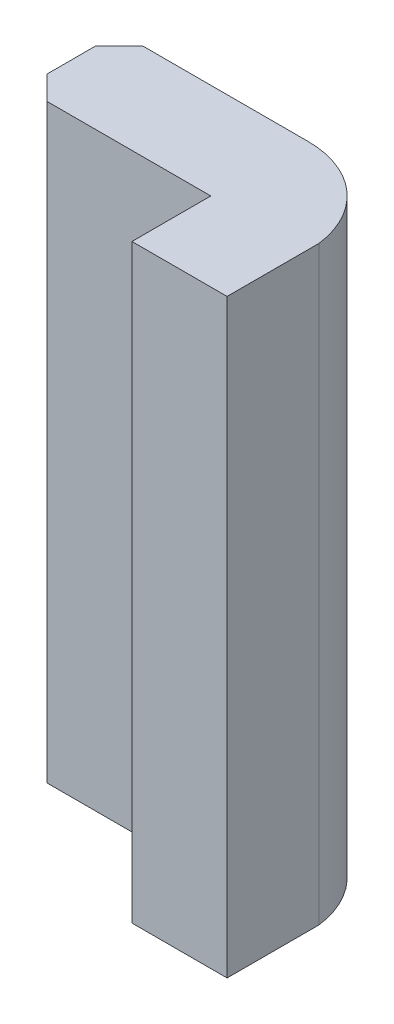
ISO-10303-21;
HEADER;
FILE_DESCRIPTION(('STEP AP214'),'2;1');
FILE_NAME('part.step','',(''),(''),'','','');
FILE_SCHEMA(('AUTOMOTIVE_DESIGN { 1 0 10303 214 1 1 1 1 }'));
ENDSEC;
DATA;
#1=APPLICATION_CONTEXT('core data for automotive mechanical design processes');
#2=APPLICATION_PROTOCOL_DEFINITION('international standard','automotive_design',2000,#1);
#3=PRODUCT_CONTEXT('',#1,'mechanical');
#4=PRODUCT('Part','Part','',(#3));
#5=PRODUCT_RELATED_PRODUCT_CATEGORY('part','',(#4));
#6=PRODUCT_DEFINITION_FORMATION('','',#4);
#7=PRODUCT_DEFINITION_CONTEXT('part definition',#1,'design');
#8=PRODUCT_DEFINITION('design','',#6,#7);
#9=PRODUCT_DEFINITION_SHAPE('','',#8);
#10=(LENGTH_UNIT() NAMED_UNIT(*) SI_UNIT(.MILLI.,.METRE.));
#11=(NAMED_UNIT(*) PLANE_ANGLE_UNIT() SI_UNIT($,.RADIAN.));
#12=(NAMED_UNIT(*) SI_UNIT($,.STERADIAN.) SOLID_ANGLE_UNIT());
#13=UNCERTAINTY_MEASURE_WITH_UNIT(LENGTH_MEASURE(1.E-05),#10,'distance_accuracy_value','');
#14=(GEOMETRIC_REPRESENTATION_CONTEXT(3) GLOBAL_UNCERTAINTY_ASSIGNED_CONTEXT((#13)) GLOBAL_UNIT_ASSIGNED_CONTEXT((#10,
#11,#12)) REPRESENTATION_CONTEXT('',''));
#15=CARTESIAN_POINT('',(0.,0.,0.));
#16=DIRECTION('',(0.,0.,1.));
#17=DIRECTION('',(1.,0.,0.));
#18=AXIS2_PLACEMENT_3D('',#15,#16,#17);
#19=CARTESIAN_POINT('',(-5.52,0.22,-2.08));
#20=DIRECTION('',(0.,0.,1.));
#21=DIRECTION('',(-1.,0.,0.));
#22=AXIS2_PLACEMENT_3D('',#19,#20,#21);
#23=PLANE('',#22);
#24=DIRECTION('',(1.,0.,0.));
#25=VECTOR('',#24,1.);
#26=CARTESIAN_POINT('',(-2.76,-1.03,-2.08));
#27=LINE('',#26,#25);
#28=CARTESIAN_POINT('',(-5.7215,-1.03,-2.08));
#29=VERTEX_POINT('',#28);
#30=CARTESIAN_POINT('',(-5.52,-1.03,-2.08));
#31=VERTEX_POINT('',#30);
#32=EDGE_CURVE('E11',#29,#31,#27,.T.);
#33=ORIENTED_EDGE('',*,*,#32,.T.);
#34=DIRECTION('',(0.,-1.,0.));
#35=VECTOR('',#34,1.);
#36=CARTESIAN_POINT('',(-5.52,0.22,-2.08));
#37=LINE('',#36,#35);
#38=CARTESIAN_POINT('',(-5.52,0.22,-2.08));
#39=VERTEX_POINT('',#38);
#40=EDGE_CURVE('E24',#39,#31,#37,.T.);
#41=ORIENTED_EDGE('',*,*,#40,.F.);
#42=DIRECTION('',(-1.,0.,0.));
#43=VECTOR('',#42,1.);
#44=CARTESIAN_POINT('',(-5.52000000001,0.22000000001,-2.08000000001));
#45=LINE('',#44,#43);
#46=CARTESIAN_POINT('',(-5.7215,0.22,-2.08));
#47=VERTEX_POINT('',#46);
#48=EDGE_CURVE('E158',#39,#47,#45,.T.);
#49=ORIENTED_EDGE('',*,*,#48,.T.);
#50=DIRECTION('',(0.,-1.,0.));
#51=VECTOR('',#50,1.);
#52=CARTESIAN_POINT('',(-5.7215,0.22,-2.08));
#53=LINE('',#52,#51);
#54=EDGE_CURVE('E156',#47,#29,#53,.T.);
#55=ORIENTED_EDGE('',*,*,#54,.T.);
#56=EDGE_LOOP('',(#33,#41,#49,#55));
#57=FACE_BOUND('',#56,.T.);
#58=ADVANCED_FACE('F17',(#57),#23,.T.);
#59=CARTESIAN_POINT('',(-5.52,0.22,-2.274448926357));
#60=DIRECTION('',(1.,0.,0.));
#61=DIRECTION('',(0.,0.,1.));
#62=AXIS2_PLACEMENT_3D('',#59,#60,#61);
#63=PLANE('',#62);
#64=DIRECTION('',(0.,0.,1.));
#65=VECTOR('',#64,1.);
#66=CARTESIAN_POINT('',(-5.52000000001,-1.03000000001,-2.274448926367));
#67=LINE('',#66,#65);
#68=CARTESIAN_POINT('',(-5.52,-1.03,-2.274448926357));
#69=VERTEX_POINT('',#68);
#70=EDGE_CURVE('E154',#69,#31,#67,.T.);
#71=ORIENTED_EDGE('',*,*,#70,.F.);
#72=DIRECTION('',(0.,-1.,0.));
#73=VECTOR('',#72,1.);
#74=CARTESIAN_POINT('',(-5.52000000001,0.22000000001,-2.274448926367));
#75=LINE('',#74,#73);
#76=CARTESIAN_POINT('',(-5.52,0.22,-2.274448926357));
#77=VERTEX_POINT('',#76);
#78=EDGE_CURVE('E152',#77,#69,#75,.T.);
#79=ORIENTED_EDGE('',*,*,#78,.F.);
#80=DIRECTION('',(0.,0.,-1.));
#81=VECTOR('',#80,1.);
#82=CARTESIAN_POINT('',(-5.52000000001,0.22000000001,-2.08000000001));
#83=LINE('',#82,#81);
#84=EDGE_CURVE('E111',#39,#77,#83,.T.);
#85=ORIENTED_EDGE('',*,*,#84,.F.);
#86=ORIENTED_EDGE('',*,*,#40,.T.);
#87=EDGE_LOOP('',(#71,#79,#85,#86));
#88=FACE_BOUND('',#87,.T.);
#89=ADVANCED_FACE('F160',(#88),#63,.T.);
#90=CARTESIAN_POINT('',(-5.7215,0.22,-0.93));
#91=DIRECTION('',(-1.,0.,0.));
#92=DIRECTION('',(0.,0.,1.));
#93=AXIS2_PLACEMENT_3D('',#90,#91,#92);
#94=PLANE('',#93);
#95=ORIENTED_EDGE('',*,*,#54,.F.);
#96=DIRECTION('',(0.,0.,-1.));
#97=VECTOR('',#96,1.);
#98=CARTESIAN_POINT('',(-5.72150000001,0.22000000001,-2.08000000001));
#99=LINE('',#98,#97);
#100=CARTESIAN_POINT('',(-5.7215,0.22,-2.247));
#101=VERTEX_POINT('',#100);
#102=EDGE_CURVE('E149',#47,#101,#99,.T.);
#103=ORIENTED_EDGE('',*,*,#102,.T.);
#104=DIRECTION('',(0.,-1.,0.));
#105=VECTOR('',#104,1.);
#106=CARTESIAN_POINT('',(-5.72150000001,0.22000000001,-2.24700000001));
#107=LINE('',#106,#105);
#108=CARTESIAN_POINT('',(-5.7215,-1.03,-2.247));
#109=VERTEX_POINT('',#108);
#110=EDGE_CURVE('E147',#101,#109,#107,.T.);
#111=ORIENTED_EDGE('',*,*,#110,.T.);
#112=DIRECTION('',(0.,0.,-1.));
#113=VECTOR('',#112,1.);
#114=CARTESIAN_POINT('',(-5.72150000001,-1.03000000001,-2.15000000001));
#115=LINE('',#114,#113);
#116=EDGE_CURVE('E145',#29,#109,#115,.T.);
#117=ORIENTED_EDGE('',*,*,#116,.F.);
#118=EDGE_LOOP('',(#95,#103,#111,#117));
#119=FACE_BOUND('',#118,.T.);
#120=ADVANCED_FACE('F179',(#119),#94,.T.);
#121=CARTESIAN_POINT('',(-5.7215,0.22,-2.247));
#122=DIRECTION('',(0.,0.,1.));
#123=DIRECTION('',(1.,0.,0.));
#124=AXIS2_PLACEMENT_3D('',#121,#122,#123);
#125=PLANE('',#124);
#126=DIRECTION('',(0.,-1.,0.));
#127=VECTOR('',#126,1.);
#128=CARTESIAN_POINT('',(-6.06850000001,0.22000000001,-2.24700000001));
#129=LINE('',#128,#127);
#130=CARTESIAN_POINT('',(-6.0685,0.22,-2.247));
#131=VERTEX_POINT('',#130);
#132=CARTESIAN_POINT('',(-6.0685,-1.03,-2.247));
#133=VERTEX_POINT('',#132);
#134=EDGE_CURVE('E143',#131,#133,#129,.T.);
#135=ORIENTED_EDGE('',*,*,#134,.T.);
#136=DIRECTION('',(-1.,0.,0.));
#137=VECTOR('',#136,1.);
#138=CARTESIAN_POINT('',(-5.72150000001,-1.03000000001,-2.24700000001));
#139=LINE('',#138,#137);
#140=EDGE_CURVE('E140',#109,#133,#139,.T.);
#141=ORIENTED_EDGE('',*,*,#140,.F.);
#142=ORIENTED_EDGE('',*,*,#110,.F.);
#143=DIRECTION('',(-1.,0.,0.));
#144=VECTOR('',#143,1.);
#145=CARTESIAN_POINT('',(-5.72150000001,0.22000000001,-2.24700000001));
#146=LINE('',#145,#144);
#147=EDGE_CURVE('E137',#101,#131,#146,.T.);
#148=ORIENTED_EDGE('',*,*,#147,.T.);
#149=EDGE_LOOP('',(#135,#141,#142,#148));
#150=FACE_BOUND('',#149,.T.);
#151=ADVANCED_FACE('F175',(#150),#125,.T.);
#152=CARTESIAN_POINT('',(-6.1185,0.22,-2.297));
#153=DIRECTION('',(-1.,0.,0.));
#154=DIRECTION('',(0.,0.,1.));
#155=AXIS2_PLACEMENT_3D('',#152,#153,#154);
#156=PLANE('',#155);
#157=DIRECTION('',(0.,-1.,0.));
#158=VECTOR('',#157,1.);
#159=CARTESIAN_POINT('',(-6.11850000001,0.22000000001,-2.40000000001));
#160=LINE('',#159,#158);
#161=CARTESIAN_POINT('',(-6.1185,0.22,-2.4));
#162=VERTEX_POINT('',#161);
#163=CARTESIAN_POINT('',(-6.1185,-1.03,-2.4));
#164=VERTEX_POINT('',#163);
#165=EDGE_CURVE('E135',#162,#164,#160,.T.);
#166=ORIENTED_EDGE('',*,*,#165,.T.);
#167=DIRECTION('',(0.,0.,-1.));
#168=VECTOR('',#167,1.);
#169=CARTESIAN_POINT('',(-6.11850000001,-1.03000000001,-2.29700000001));
#170=LINE('',#169,#168);
#171=CARTESIAN_POINT('',(-6.1185,-1.03,-2.297));
#172=VERTEX_POINT('',#171);
#173=EDGE_CURVE('E132',#172,#164,#170,.T.);
#174=ORIENTED_EDGE('',*,*,#173,.F.);
#175=DIRECTION('',(0.,-1.,0.));
#176=VECTOR('',#175,1.);
#177=CARTESIAN_POINT('',(-6.11850000001,0.22000000001,-2.29700000001));
#178=LINE('',#177,#176);
#179=CARTESIAN_POINT('',(-6.1185,0.22,-2.297));
#180=VERTEX_POINT('',#179);
#181=EDGE_CURVE('E129',#180,#172,#178,.T.);
#182=ORIENTED_EDGE('',*,*,#181,.F.);
#183=DIRECTION('',(0.,0.,-1.));
#184=VECTOR('',#183,1.);
#185=CARTESIAN_POINT('',(-6.11850000001,0.22000000001,-2.29700000001));
#186=LINE('',#185,#184);
#187=EDGE_CURVE('E126',#180,#162,#186,.T.);
#188=ORIENTED_EDGE('',*,*,#187,.T.);
#189=EDGE_LOOP('',(#166,#174,#182,#188));
#190=FACE_BOUND('',#189,.T.);
#191=ADVANCED_FACE('F193',(#190),#156,.T.);
#192=CARTESIAN_POINT('',(-6.1185,0.22,-2.4));
#193=DIRECTION('',(-0.707106781186498,0.,-0.707106781186598));
#194=DIRECTION('',(-0.707106781186598,0.,0.707106781186498));
#195=AXIS2_PLACEMENT_3D('',#192,#193,#194);
#196=PLANE('',#195);
#197=DIRECTION('',(0.,-1.,0.));
#198=VECTOR('',#197,1.);
#199=CARTESIAN_POINT('',(-6.06850000001,0.22000000001,-2.45000000001));
#200=LINE('',#199,#198);
#201=CARTESIAN_POINT('',(-6.0685,0.22,-2.45));
#202=VERTEX_POINT('',#201);
#203=CARTESIAN_POINT('',(-6.0685,-1.03,-2.45));
#204=VERTEX_POINT('',#203);
#205=EDGE_CURVE('E101',#202,#204,#200,.T.);
#206=ORIENTED_EDGE('',*,*,#205,.T.);
#207=DIRECTION('',(0.707106781186598,0.,-0.707106781186498));
#208=VECTOR('',#207,1.);
#209=CARTESIAN_POINT('',(-6.11850000001,-1.03000000001,-2.40000000001));
#210=LINE('',#209,#208);
#211=EDGE_CURVE('E122',#164,#204,#210,.T.);
#212=ORIENTED_EDGE('',*,*,#211,.F.);
#213=ORIENTED_EDGE('',*,*,#165,.F.);
#214=DIRECTION('',(0.707106781186598,0.,-0.707106781186498));
#215=VECTOR('',#214,1.);
#216=CARTESIAN_POINT('',(-6.11850000001,0.22000000001,-2.40000000001));
#217=LINE('',#216,#215);
#218=EDGE_CURVE('E95',#162,#202,#217,.T.);
#219=ORIENTED_EDGE('',*,*,#218,.T.);
#220=EDGE_LOOP('',(#206,#212,#213,#219));
#221=FACE_BOUND('',#220,.T.);
#222=ADVANCED_FACE('F164',(#221),#196,.T.);
#223=CARTESIAN_POINT('',(-6.0685,0.22,-2.45));
#224=DIRECTION('',(0.,0.,-1.));
#225=DIRECTION('',(0.,-1.,0.));
#226=AXIS2_PLACEMENT_3D('',#223,#224,#225);
#227=PLANE('',#226);
#228=DIRECTION('',(0.,-1.,0.));
#229=VECTOR('',#228,1.);
#230=CARTESIAN_POINT('',(-5.71850000001,0.22000000001,-2.45000000001));
#231=LINE('',#230,#229);
#232=CARTESIAN_POINT('',(-5.7185,0.22,-2.45));
#233=VERTEX_POINT('',#232);
#234=CARTESIAN_POINT('',(-5.7185,-1.03,-2.45));
#235=VERTEX_POINT('',#234);
#236=EDGE_CURVE('E84',#233,#235,#231,.T.);
#237=ORIENTED_EDGE('',*,*,#236,.T.);
#238=DIRECTION('',(1.,0.,0.));
#239=VECTOR('',#238,1.);
#240=CARTESIAN_POINT('',(-6.06850000001,-1.03000000001,-2.45000000001));
#241=LINE('',#240,#239);
#242=EDGE_CURVE('E96',#204,#235,#241,.T.);
#243=ORIENTED_EDGE('',*,*,#242,.F.);
#244=ORIENTED_EDGE('',*,*,#205,.F.);
#245=DIRECTION('',(1.,0.,0.));
#246=VECTOR('',#245,1.);
#247=CARTESIAN_POINT('',(-6.06850000001,0.22000000001,-2.45000000001));
#248=LINE('',#247,#246);
#249=EDGE_CURVE('E99',#202,#233,#248,.T.);
#250=ORIENTED_EDGE('',*,*,#249,.T.);
#251=EDGE_LOOP('',(#237,#243,#244,#250));
#252=FACE_BOUND('',#251,.T.);
#253=ADVANCED_FACE('F100',(#252),#227,.T.);
#254=CARTESIAN_POINT('',(-6.0685,0.22,-2.247));
#255=DIRECTION('',(-0.707106781186598,0.,0.707106781186498));
#256=DIRECTION('',(0.,1.,0.));
#257=AXIS2_PLACEMENT_3D('',#254,#255,#256);
#258=PLANE('',#257);
#259=ORIENTED_EDGE('',*,*,#181,.T.);
#260=DIRECTION('',(-0.707106781186498,0.,-0.707106781186598));
#261=VECTOR('',#260,1.);
#262=CARTESIAN_POINT('',(-6.06850000001,-1.03000000001,-2.24700000001));
#263=LINE('',#262,#261);
#264=EDGE_CURVE('E105',#133,#172,#263,.T.);
#265=ORIENTED_EDGE('',*,*,#264,.F.);
#266=ORIENTED_EDGE('',*,*,#134,.F.);
#267=DIRECTION('',(-0.707106781186498,0.,-0.707106781186598));
#268=VECTOR('',#267,1.);
#269=CARTESIAN_POINT('',(-6.06850000001,0.22000000001,-2.24700000001));
#270=LINE('',#269,#268);
#271=EDGE_CURVE('E113',#131,#180,#270,.T.);
#272=ORIENTED_EDGE('',*,*,#271,.T.);
#273=EDGE_LOOP('',(#259,#265,#266,#272));
#274=FACE_BOUND('',#273,.T.);
#275=ADVANCED_FACE('F170',(#274),#258,.T.);
#276=CARTESIAN_POINT('',(-5.7185,0.22,-2.25));
#277=DIRECTION('',(0.,1.,0.));
#278=DIRECTION('',(1.,0.,0.));
#279=AXIS2_PLACEMENT_3D('',#276,#277,#278);
#280=CYLINDRICAL_SURFACE('',#279,0.2);
#281=CARTESIAN_POINT('',(-5.71850000001,-1.03000000001,-2.25000000001));
#282=DIRECTION('',(0.,-1.,0.));
#283=DIRECTION('',(0.,0.,-1.));
#284=AXIS2_PLACEMENT_3D('',#281,#282,#283);
#285=CIRCLE('',#284,0.2);
#286=EDGE_CURVE('E91',#235,#69,#285,.T.);
#287=ORIENTED_EDGE('',*,*,#286,.F.);
#288=ORIENTED_EDGE('',*,*,#236,.F.);
#289=CARTESIAN_POINT('',(-5.71850000001,0.22000000001,-2.25000000001));
#290=DIRECTION('',(0.,-1.,0.));
#291=DIRECTION('',(0.,0.,-1.));
#292=AXIS2_PLACEMENT_3D('',#289,#290,#291);
#293=CIRCLE('',#292,0.2);
#294=EDGE_CURVE('E89',#233,#77,#293,.T.);
#295=ORIENTED_EDGE('',*,*,#294,.T.);
#296=ORIENTED_EDGE('',*,*,#78,.T.);
#297=EDGE_LOOP('',(#287,#288,#295,#296));
#298=FACE_BOUND('',#297,.T.);
#299=ADVANCED_FACE('F86',(#298),#280,.T.);
#300=CARTESIAN_POINT('',(0.,0.22,-2.4));
#301=DIRECTION('',(0.,-1.,0.));
#302=DIRECTION('',(0.,0.,-1.));
#303=AXIS2_PLACEMENT_3D('',#300,#301,#302);
#304=PLANE('',#303);
#305=ORIENTED_EDGE('',*,*,#84,.T.);
#306=ORIENTED_EDGE('',*,*,#294,.F.);
#307=ORIENTED_EDGE('',*,*,#249,.F.);
#308=ORIENTED_EDGE('',*,*,#218,.F.);
#309=ORIENTED_EDGE('',*,*,#187,.F.);
#310=ORIENTED_EDGE('',*,*,#271,.F.);
#311=ORIENTED_EDGE('',*,*,#147,.F.);
#312=ORIENTED_EDGE('',*,*,#102,.F.);
#313=ORIENTED_EDGE('',*,*,#48,.F.);
#314=EDGE_LOOP('',(#305,#306,#307,#308,#309,#310,#311,#312,#313));
#315=FACE_BOUND('',#314,.T.);
#316=ADVANCED_FACE('F108',(#315),#304,.F.);
#317=CARTESIAN_POINT('',(0.,-1.03,-2.4));
#318=DIRECTION('',(0.,-1.,0.));
#319=DIRECTION('',(0.,0.,-1.));
#320=AXIS2_PLACEMENT_3D('',#317,#318,#319);
#321=PLANE('',#320);
#322=ORIENTED_EDGE('',*,*,#116,.T.);
#323=ORIENTED_EDGE('',*,*,#140,.T.);
#324=ORIENTED_EDGE('',*,*,#264,.T.);
#325=ORIENTED_EDGE('',*,*,#173,.T.);
#326=ORIENTED_EDGE('',*,*,#211,.T.);
#327=ORIENTED_EDGE('',*,*,#242,.T.);
#328=ORIENTED_EDGE('',*,*,#286,.T.);
#329=ORIENTED_EDGE('',*,*,#70,.T.);
#330=ORIENTED_EDGE('',*,*,#32,.F.);
#331=EDGE_LOOP('',(#322,#323,#324,#325,#326,#327,#328,#329,#330));
#332=FACE_BOUND('',#331,.T.);
#333=ADVANCED_FACE('F161',(#332),#321,.T.);
#334=CLOSED_SHELL('',(#58,#89,#120,#151,#191,#222,#253,#275,#299,#316,#333));
#335=MANIFOLD_SOLID_BREP('B1',#334);
#336=ADVANCED_BREP_SHAPE_REPRESENTATION('',(#18,#335),#14);
#337=SHAPE_DEFINITION_REPRESENTATION(#9,#336);
ENDSEC;
END-ISO-10303-21;
